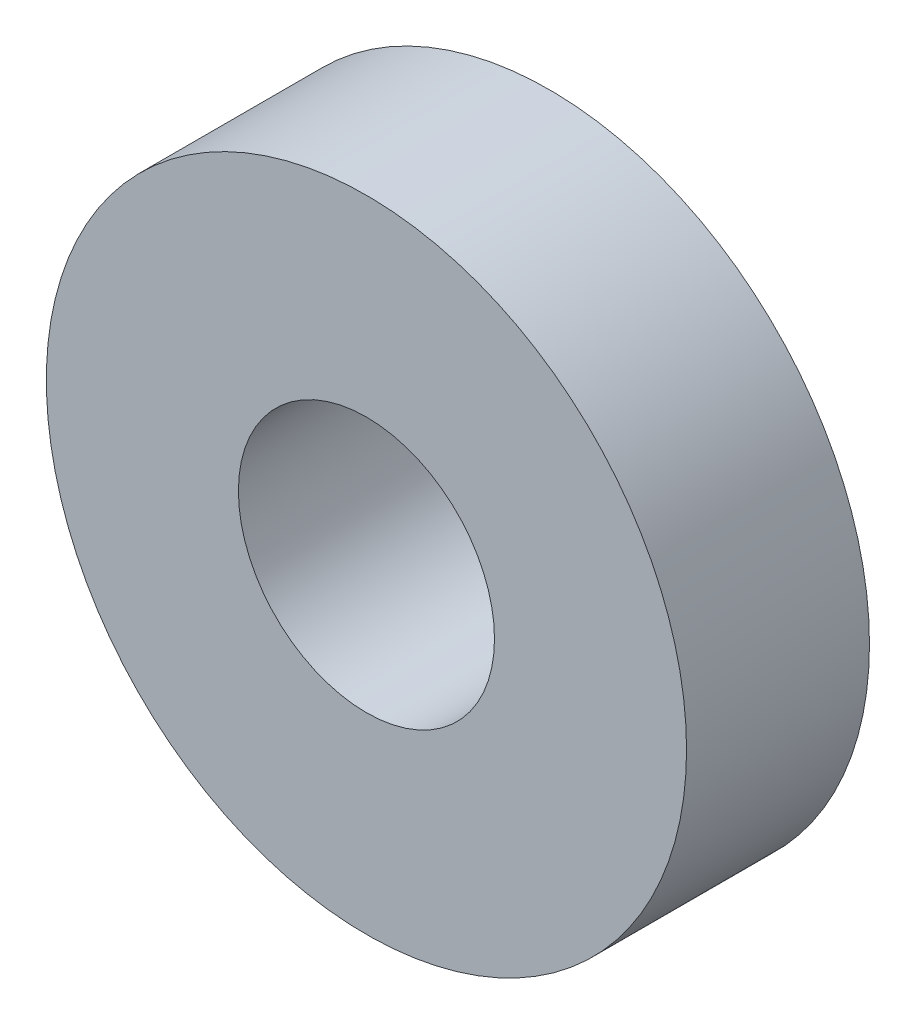
ISO-10303-21;
HEADER;
FILE_DESCRIPTION(('STEP AP214'),'2;1');
FILE_NAME('part.step','',(''),(''),'','','');
FILE_SCHEMA(('AUTOMOTIVE_DESIGN { 1 0 10303 214 1 1 1 1 }'));
ENDSEC;
DATA;
#1=APPLICATION_CONTEXT('core data for automotive mechanical design processes');
#2=APPLICATION_PROTOCOL_DEFINITION('international standard','automotive_design',2000,#1);
#3=PRODUCT_CONTEXT('',#1,'mechanical');
#4=PRODUCT('Part','Part','',(#3));
#5=PRODUCT_RELATED_PRODUCT_CATEGORY('part','',(#4));
#6=PRODUCT_DEFINITION_FORMATION('','',#4);
#7=PRODUCT_DEFINITION_CONTEXT('part definition',#1,'design');
#8=PRODUCT_DEFINITION('design','',#6,#7);
#9=PRODUCT_DEFINITION_SHAPE('','',#8);
#10=(LENGTH_UNIT() NAMED_UNIT(*) SI_UNIT(.MILLI.,.METRE.));
#11=(NAMED_UNIT(*) PLANE_ANGLE_UNIT() SI_UNIT($,.RADIAN.));
#12=(NAMED_UNIT(*) SI_UNIT($,.STERADIAN.) SOLID_ANGLE_UNIT());
#13=UNCERTAINTY_MEASURE_WITH_UNIT(LENGTH_MEASURE(1.E-05),#10,'distance_accuracy_value','');
#14=(GEOMETRIC_REPRESENTATION_CONTEXT(3) GLOBAL_UNCERTAINTY_ASSIGNED_CONTEXT((#13)) GLOBAL_UNIT_ASSIGNED_CONTEXT((#10,
#11,#12)) REPRESENTATION_CONTEXT('',''));
#15=CARTESIAN_POINT('',(0.,0.,0.));
#16=DIRECTION('',(0.,0.,1.));
#17=DIRECTION('',(1.,0.,0.));
#18=AXIS2_PLACEMENT_3D('',#15,#16,#17);
#19=CARTESIAN_POINT('',(0.,0.,0.));
#20=DIRECTION('',(0.,0.,1.));
#21=DIRECTION('',(1.,0.,0.));
#22=AXIS2_PLACEMENT_3D('',#19,#20,#21);
#23=PLANE('',#22);
#24=CARTESIAN_POINT('',(12.8293385803761,-23.0417841378882,0.));
#25=DIRECTION('',(0.,0.,-1.));
#26=DIRECTION('',(-1.,0.,0.));
#27=AXIS2_PLACEMENT_3D('',#24,#25,#26);
#28=CIRCLE('',#27,4.00000000000001);
#29=CARTESIAN_POINT('',(8.8293385803761,-23.0417841378882,0.));
#30=VERTEX_POINT('',#29);
#31=EDGE_CURVE('E67',#30,#30,#28,.T.);
#32=ORIENTED_EDGE('',*,*,#31,.F.);
#33=EDGE_LOOP('',(#32));
#34=FACE_BOUND('',#33,.T.);
#35=CARTESIAN_POINT('',(-26.3690966091135,0.431843358408401,0.));
#36=DIRECTION('',(0.,0.,-1.));
#37=DIRECTION('',(-1.,0.,0.));
#38=AXIS2_PLACEMENT_3D('',#35,#36,#37);
#39=CIRCLE('',#38,4.);
#40=CARTESIAN_POINT('',(-30.3690966091135,0.431843358408401,0.));
#41=VERTEX_POINT('',#40);
#42=EDGE_CURVE('E79',#41,#41,#39,.T.);
#43=ORIENTED_EDGE('',*,*,#42,.F.);
#44=EDGE_LOOP('',(#43));
#45=FACE_BOUND('',#44,.T.);
#46=CARTESIAN_POINT('',(13.5889936084931,22.6021016141264,0.));
#47=DIRECTION('',(0.,0.,-1.));
#48=DIRECTION('',(-1.,0.,0.));
#49=AXIS2_PLACEMENT_3D('',#46,#47,#48);
#50=CIRCLE('',#49,4.);
#51=CARTESIAN_POINT('',(9.58899360849312,22.6021016141264,0.));
#52=VERTEX_POINT('',#51);
#53=EDGE_CURVE('E54',#52,#52,#50,.T.);
#54=ORIENTED_EDGE('',*,*,#53,.F.);
#55=EDGE_LOOP('',(#54));
#56=FACE_BOUND('',#55,.T.);
#57=CARTESIAN_POINT('',(0.,0.,0.));
#58=DIRECTION('',(0.,0.,-1.));
#59=DIRECTION('',(-1.,0.,0.));
#60=AXIS2_PLACEMENT_3D('',#57,#58,#59);
#61=CIRCLE('',#60,14.);
#62=CARTESIAN_POINT('',(-14.,0.,0.));
#63=VERTEX_POINT('',#62);
#64=EDGE_CURVE('E49',#63,#63,#61,.T.);
#65=ORIENTED_EDGE('',*,*,#64,.F.);
#66=EDGE_LOOP('',(#65));
#67=FACE_BOUND('',#66,.T.);
#68=CARTESIAN_POINT('',(0.,0.,0.));
#69=DIRECTION('',(0.,0.,1.));
#70=DIRECTION('',(1.,0.,0.));
#71=AXIS2_PLACEMENT_3D('',#68,#69,#70);
#72=CIRCLE('',#71,35.);
#73=CARTESIAN_POINT('',(35.,0.,0.));
#74=VERTEX_POINT('',#73);
#75=EDGE_CURVE('E42',#74,#74,#72,.T.);
#76=ORIENTED_EDGE('',*,*,#75,.F.);
#77=EDGE_LOOP('',(#76));
#78=FACE_BOUND('',#77,.T.);
#79=CARTESIAN_POINT('',(-13.5889936084931,22.6021016141264,0.));
#80=DIRECTION('',(0.,0.,-1.));
#81=DIRECTION('',(-1.,0.,0.));
#82=AXIS2_PLACEMENT_3D('',#79,#80,#81);
#83=CIRCLE('',#82,4.);
#84=CARTESIAN_POINT('',(-17.5889936084931,22.6021016141264,0.));
#85=VERTEX_POINT('',#84);
#86=EDGE_CURVE('E85',#85,#85,#83,.F.);
#87=ORIENTED_EDGE('',*,*,#86,.T.);
#88=EDGE_LOOP('',(#87));
#89=FACE_BOUND('',#88,.T.);
#90=CARTESIAN_POINT('',(-12.8416013543717,-23.0349521232922,0.));
#91=DIRECTION('',(0.,0.,-1.));
#92=DIRECTION('',(-1.,0.,0.));
#93=AXIS2_PLACEMENT_3D('',#90,#91,#92);
#94=CIRCLE('',#93,4.00000000000001);
#95=CARTESIAN_POINT('',(-16.8416013543717,-23.0349521232922,0.));
#96=VERTEX_POINT('',#95);
#97=EDGE_CURVE('E73',#96,#96,#94,.F.);
#98=ORIENTED_EDGE('',*,*,#97,.T.);
#99=EDGE_LOOP('',(#98));
#100=FACE_BOUND('',#99,.T.);
#101=CARTESIAN_POINT('',(26.3690966091135,0.431843358408401,0.));
#102=DIRECTION('',(0.,0.,-1.));
#103=DIRECTION('',(-1.,0.,0.));
#104=AXIS2_PLACEMENT_3D('',#101,#102,#103);
#105=CIRCLE('',#104,4.);
#106=CARTESIAN_POINT('',(22.3690966091135,0.431843358408401,0.));
#107=VERTEX_POINT('',#106);
#108=EDGE_CURVE('E60',#107,#107,#105,.F.);
#109=ORIENTED_EDGE('',*,*,#108,.T.);
#110=EDGE_LOOP('',(#109));
#111=FACE_BOUND('',#110,.T.);
#112=ADVANCED_FACE('F38',(#34,#45,#56,#67,#78,#89,#100,#111),#23,.F.);
#113=CARTESIAN_POINT('',(0.,0.,20.));
#114=DIRECTION('',(0.,0.,1.));
#115=DIRECTION('',(1.,0.,0.));
#116=AXIS2_PLACEMENT_3D('',#113,#114,#115);
#117=PLANE('',#116);
#118=CARTESIAN_POINT('',(0.,0.,20.));
#119=DIRECTION('',(0.,0.,1.));
#120=DIRECTION('',(1.,0.,0.));
#121=AXIS2_PLACEMENT_3D('',#118,#119,#120);
#122=CIRCLE('',#121,14.);
#123=CARTESIAN_POINT('',(14.,0.,20.));
#124=VERTEX_POINT('',#123);
#125=EDGE_CURVE('E64',#124,#124,#122,.T.);
#126=ORIENTED_EDGE('',*,*,#125,.F.);
#127=EDGE_LOOP('',(#126));
#128=FACE_BOUND('',#127,.T.);
#129=CARTESIAN_POINT('',(0.,0.,20.));
#130=DIRECTION('',(0.,0.,1.));
#131=DIRECTION('',(1.,0.,0.));
#132=AXIS2_PLACEMENT_3D('',#129,#130,#131);
#133=CIRCLE('',#132,35.);
#134=CARTESIAN_POINT('',(35.,0.,20.));
#135=VERTEX_POINT('',#134);
#136=EDGE_CURVE('E10',#135,#135,#133,.T.);
#137=ORIENTED_EDGE('',*,*,#136,.T.);
#138=EDGE_LOOP('',(#137));
#139=FACE_BOUND('',#138,.T.);
#140=ADVANCED_FACE('F95',(#128,#139),#117,.T.);
#141=CARTESIAN_POINT('',(0.,0.,20.));
#142=DIRECTION('',(0.,0.,-1.));
#143=DIRECTION('',(-1.,0.,0.));
#144=AXIS2_PLACEMENT_3D('',#141,#142,#143);
#145=CYLINDRICAL_SURFACE('',#144,35.);
#146=ORIENTED_EDGE('',*,*,#136,.F.);
#147=EDGE_LOOP('',(#146));
#148=FACE_BOUND('',#147,.T.);
#149=ORIENTED_EDGE('',*,*,#75,.T.);
#150=EDGE_LOOP('',(#149));
#151=FACE_BOUND('',#150,.T.);
#152=ADVANCED_FACE('F40',(#148,#151),#145,.T.);
#153=CARTESIAN_POINT('',(0.,0.,5.));
#154=DIRECTION('',(0.,0.,-1.));
#155=DIRECTION('',(-1.,0.,0.));
#156=AXIS2_PLACEMENT_3D('',#153,#154,#155);
#157=CYLINDRICAL_SURFACE('',#156,14.);
#158=ORIENTED_EDGE('',*,*,#64,.T.);
#159=EDGE_LOOP('',(#158));
#160=FACE_BOUND('',#159,.T.);
#161=ORIENTED_EDGE('',*,*,#125,.T.);
#162=EDGE_LOOP('',(#161));
#163=FACE_BOUND('',#162,.T.);
#164=ADVANCED_FACE('F93',(#160,#163),#157,.F.);
#165=CARTESIAN_POINT('',(13.5889936084931,22.6021016141264,4.99999999999997));
#166=DIRECTION('',(0.,0.,-1.));
#167=DIRECTION('',(-1.,0.,0.));
#168=AXIS2_PLACEMENT_3D('',#165,#166,#167);
#169=CYLINDRICAL_SURFACE('',#168,4.);
#170=CARTESIAN_POINT('',(13.5889936084931,22.6021016141264,4.99999999999997));
#171=DIRECTION('',(0.,0.,-1.));
#172=DIRECTION('',(-1.,0.,0.));
#173=AXIS2_PLACEMENT_3D('',#170,#171,#172);
#174=CIRCLE('',#173,4.);
#175=CARTESIAN_POINT('',(9.58899360849312,22.6021016141264,4.99999999999997));
#176=VERTEX_POINT('',#175);
#177=EDGE_CURVE('E53',#176,#176,#174,.T.);
#178=ORIENTED_EDGE('',*,*,#177,.F.);
#179=EDGE_LOOP('',(#178));
#180=FACE_BOUND('',#179,.T.);
#181=ORIENTED_EDGE('',*,*,#53,.T.);
#182=EDGE_LOOP('',(#181));
#183=FACE_BOUND('',#182,.T.);
#184=ADVANCED_FACE('F107',(#180,#183),#169,.F.);
#185=CARTESIAN_POINT('',(0.,0.,4.99999999999997));
#186=DIRECTION('',(0.,0.,-1.));
#187=DIRECTION('',(-1.,0.,0.));
#188=AXIS2_PLACEMENT_3D('',#185,#186,#187);
#189=PLANE('',#188);
#190=ORIENTED_EDGE('',*,*,#177,.T.);
#191=EDGE_LOOP('',(#190));
#192=FACE_BOUND('',#191,.T.);
#193=ADVANCED_FACE('F111',(#192),#189,.T.);
#194=CARTESIAN_POINT('',(-13.5889936084931,22.6021016141264,4.99999999999997));
#195=DIRECTION('',(0.,0.,-1.));
#196=DIRECTION('',(-1.,0.,0.));
#197=AXIS2_PLACEMENT_3D('',#194,#195,#196);
#198=CYLINDRICAL_SURFACE('',#197,4.);
#199=CARTESIAN_POINT('',(-13.5889936084931,22.6021016141264,4.99999999999997));
#200=DIRECTION('',(0.,0.,-1.));
#201=DIRECTION('',(-1.,0.,0.));
#202=AXIS2_PLACEMENT_3D('',#199,#200,#201);
#203=CIRCLE('',#202,4.);
#204=CARTESIAN_POINT('',(-17.5889936084931,22.6021016141264,4.99999999999997));
#205=VERTEX_POINT('',#204);
#206=EDGE_CURVE('E57',#205,#205,#203,.F.);
#207=ORIENTED_EDGE('',*,*,#206,.T.);
#208=EDGE_LOOP('',(#207));
#209=FACE_BOUND('',#208,.T.);
#210=ORIENTED_EDGE('',*,*,#86,.F.);
#211=EDGE_LOOP('',(#210));
#212=FACE_BOUND('',#211,.T.);
#213=ADVANCED_FACE('F115',(#209,#212),#198,.F.);
#214=CARTESIAN_POINT('',(0.,0.,4.99999999999997));
#215=DIRECTION('',(0.,0.,-1.));
#216=DIRECTION('',(-1.,0.,0.));
#217=AXIS2_PLACEMENT_3D('',#214,#215,#216);
#218=PLANE('',#217);
#219=ORIENTED_EDGE('',*,*,#206,.F.);
#220=EDGE_LOOP('',(#219));
#221=FACE_BOUND('',#220,.T.);
#222=ADVANCED_FACE('F145',(#221),#218,.T.);
#223=CARTESIAN_POINT('',(-26.3690966091135,0.431843358408401,4.99999999999997));
#224=DIRECTION('',(0.,0.,-1.));
#225=DIRECTION('',(-1.,0.,0.));
#226=AXIS2_PLACEMENT_3D('',#223,#224,#225);
#227=CYLINDRICAL_SURFACE('',#226,4.);
#228=CARTESIAN_POINT('',(-26.3690966091135,0.431843358408401,4.99999999999997));
#229=DIRECTION('',(0.,0.,-1.));
#230=DIRECTION('',(-1.,0.,0.));
#231=AXIS2_PLACEMENT_3D('',#228,#229,#230);
#232=CIRCLE('',#231,4.);
#233=CARTESIAN_POINT('',(-30.3690966091135,0.431843358408401,4.99999999999997));
#234=VERTEX_POINT('',#233);
#235=EDGE_CURVE('E82',#234,#234,#232,.T.);
#236=ORIENTED_EDGE('',*,*,#235,.F.);
#237=EDGE_LOOP('',(#236));
#238=FACE_BOUND('',#237,.T.);
#239=ORIENTED_EDGE('',*,*,#42,.T.);
#240=EDGE_LOOP('',(#239));
#241=FACE_BOUND('',#240,.T.);
#242=ADVANCED_FACE('F142',(#238,#241),#227,.F.);
#243=CARTESIAN_POINT('',(0.,0.,4.99999999999997));
#244=DIRECTION('',(0.,0.,-1.));
#245=DIRECTION('',(-1.,0.,0.));
#246=AXIS2_PLACEMENT_3D('',#243,#244,#245);
#247=PLANE('',#246);
#248=ORIENTED_EDGE('',*,*,#235,.T.);
#249=EDGE_LOOP('',(#248));
#250=FACE_BOUND('',#249,.T.);
#251=ADVANCED_FACE('F137',(#250),#247,.T.);
#252=CARTESIAN_POINT('',(-12.8416013543717,-23.0349521232922,4.99999999999997));
#253=DIRECTION('',(0.,0.,-1.));
#254=DIRECTION('',(-1.,0.,0.));
#255=AXIS2_PLACEMENT_3D('',#252,#253,#254);
#256=CYLINDRICAL_SURFACE('',#255,4.00000000000001);
#257=CARTESIAN_POINT('',(-12.8416013543717,-23.0349521232922,4.99999999999997));
#258=DIRECTION('',(0.,0.,-1.));
#259=DIRECTION('',(-1.,0.,0.));
#260=AXIS2_PLACEMENT_3D('',#257,#258,#259);
#261=CIRCLE('',#260,4.00000000000001);
#262=CARTESIAN_POINT('',(-16.8416013543717,-23.0349521232922,4.99999999999997));
#263=VERTEX_POINT('',#262);
#264=EDGE_CURVE('E76',#263,#263,#261,.F.);
#265=ORIENTED_EDGE('',*,*,#264,.T.);
#266=EDGE_LOOP('',(#265));
#267=FACE_BOUND('',#266,.T.);
#268=ORIENTED_EDGE('',*,*,#97,.F.);
#269=EDGE_LOOP('',(#268));
#270=FACE_BOUND('',#269,.T.);
#271=ADVANCED_FACE('F134',(#267,#270),#256,.F.);
#272=CARTESIAN_POINT('',(0.,0.,4.99999999999997));
#273=DIRECTION('',(0.,0.,-1.));
#274=DIRECTION('',(-1.,0.,0.));
#275=AXIS2_PLACEMENT_3D('',#272,#273,#274);
#276=PLANE('',#275);
#277=ORIENTED_EDGE('',*,*,#264,.F.);
#278=EDGE_LOOP('',(#277));
#279=FACE_BOUND('',#278,.T.);
#280=ADVANCED_FACE('F129',(#279),#276,.T.);
#281=CARTESIAN_POINT('',(12.8293385803761,-23.0417841378882,4.99999999999997));
#282=DIRECTION('',(0.,0.,-1.));
#283=DIRECTION('',(-1.,0.,0.));
#284=AXIS2_PLACEMENT_3D('',#281,#282,#283);
#285=CYLINDRICAL_SURFACE('',#284,4.00000000000001);
#286=CARTESIAN_POINT('',(12.8293385803761,-23.0417841378882,4.99999999999997));
#287=DIRECTION('',(0.,0.,-1.));
#288=DIRECTION('',(-1.,0.,0.));
#289=AXIS2_PLACEMENT_3D('',#286,#287,#288);
#290=CIRCLE('',#289,4.00000000000001);
#291=CARTESIAN_POINT('',(8.8293385803761,-23.0417841378882,4.99999999999997));
#292=VERTEX_POINT('',#291);
#293=EDGE_CURVE('E70',#292,#292,#290,.T.);
#294=ORIENTED_EDGE('',*,*,#293,.F.);
#295=EDGE_LOOP('',(#294));
#296=FACE_BOUND('',#295,.T.);
#297=ORIENTED_EDGE('',*,*,#31,.T.);
#298=EDGE_LOOP('',(#297));
#299=FACE_BOUND('',#298,.T.);
#300=ADVANCED_FACE('F126',(#296,#299),#285,.F.);
#301=CARTESIAN_POINT('',(0.,0.,4.99999999999997));
#302=DIRECTION('',(0.,0.,-1.));
#303=DIRECTION('',(-1.,0.,0.));
#304=AXIS2_PLACEMENT_3D('',#301,#302,#303);
#305=PLANE('',#304);
#306=ORIENTED_EDGE('',*,*,#293,.T.);
#307=EDGE_LOOP('',(#306));
#308=FACE_BOUND('',#307,.T.);
#309=ADVANCED_FACE('F121',(#308),#305,.T.);
#310=CARTESIAN_POINT('',(26.3690966091135,0.431843358408401,4.99999999999997));
#311=DIRECTION('',(0.,0.,-1.));
#312=DIRECTION('',(-1.,0.,0.));
#313=AXIS2_PLACEMENT_3D('',#310,#311,#312);
#314=CYLINDRICAL_SURFACE('',#313,4.);
#315=CARTESIAN_POINT('',(26.3690966091135,0.431843358408401,4.99999999999997));
#316=DIRECTION('',(0.,0.,-1.));
#317=DIRECTION('',(-1.,0.,0.));
#318=AXIS2_PLACEMENT_3D('',#315,#316,#317);
#319=CIRCLE('',#318,4.);
#320=CARTESIAN_POINT('',(22.3690966091135,0.431843358408401,4.99999999999997));
#321=VERTEX_POINT('',#320);
#322=EDGE_CURVE('E63',#321,#321,#319,.F.);
#323=ORIENTED_EDGE('',*,*,#322,.T.);
#324=EDGE_LOOP('',(#323));
#325=FACE_BOUND('',#324,.T.);
#326=ORIENTED_EDGE('',*,*,#108,.F.);
#327=EDGE_LOOP('',(#326));
#328=FACE_BOUND('',#327,.T.);
#329=ADVANCED_FACE('F117',(#325,#328),#314,.F.);
#330=CARTESIAN_POINT('',(0.,0.,4.99999999999997));
#331=DIRECTION('',(0.,0.,-1.));
#332=DIRECTION('',(-1.,0.,0.));
#333=AXIS2_PLACEMENT_3D('',#330,#331,#332);
#334=PLANE('',#333);
#335=ORIENTED_EDGE('',*,*,#322,.F.);
#336=EDGE_LOOP('',(#335));
#337=FACE_BOUND('',#336,.T.);
#338=ADVANCED_FACE('F120',(#337),#334,.T.);
#339=CLOSED_SHELL('',(#112,#140,#152,#164,#184,#193,#213,#222,#242,#251,#271,#280,#300,#309,
#329,#338));
#340=MANIFOLD_SOLID_BREP('B2',#339);
#341=ADVANCED_BREP_SHAPE_REPRESENTATION('',(#18,#340),#14);
#342=SHAPE_DEFINITION_REPRESENTATION(#9,#341);
ENDSEC;
END-ISO-10303-21;
